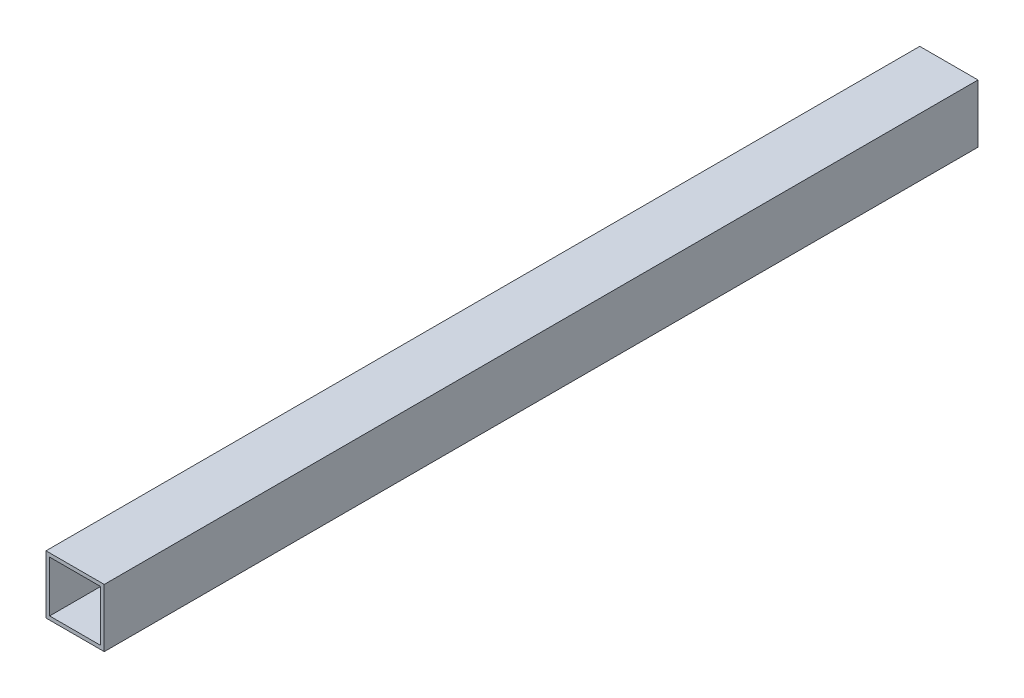
ISO-10303-21;
HEADER;
FILE_DESCRIPTION(('STEP AP214'),'2;1');
FILE_NAME('part.step','',(''),(''),'','','');
FILE_SCHEMA(('AUTOMOTIVE_DESIGN { 1 0 10303 214 1 1 1 1 }'));
ENDSEC;
DATA;
#1=APPLICATION_CONTEXT('core data for automotive mechanical design processes');
#2=APPLICATION_PROTOCOL_DEFINITION('international standard','automotive_design',2000,#1);
#3=PRODUCT_CONTEXT('',#1,'mechanical');
#4=PRODUCT('Part','Part','',(#3));
#5=PRODUCT_RELATED_PRODUCT_CATEGORY('part','',(#4));
#6=PRODUCT_DEFINITION_FORMATION('','',#4);
#7=PRODUCT_DEFINITION_CONTEXT('part definition',#1,'design');
#8=PRODUCT_DEFINITION('design','',#6,#7);
#9=PRODUCT_DEFINITION_SHAPE('','',#8);
#10=(LENGTH_UNIT() NAMED_UNIT(*) SI_UNIT(.MILLI.,.METRE.));
#11=(NAMED_UNIT(*) PLANE_ANGLE_UNIT() SI_UNIT($,.RADIAN.));
#12=(NAMED_UNIT(*) SI_UNIT($,.STERADIAN.) SOLID_ANGLE_UNIT());
#13=UNCERTAINTY_MEASURE_WITH_UNIT(LENGTH_MEASURE(1.E-05),#10,'distance_accuracy_value','');
#14=(GEOMETRIC_REPRESENTATION_CONTEXT(3) GLOBAL_UNCERTAINTY_ASSIGNED_CONTEXT((#13)) GLOBAL_UNIT_ASSIGNED_CONTEXT((#10,
#11,#12)) REPRESENTATION_CONTEXT('',''));
#15=CARTESIAN_POINT('',(0.,0.,0.));
#16=DIRECTION('',(0.,0.,1.));
#17=DIRECTION('',(1.,0.,0.));
#18=AXIS2_PLACEMENT_3D('',#15,#16,#17);
#19=CARTESIAN_POINT('',(12.7,25.4,190.5));
#20=DIRECTION('',(-1.,0.,0.));
#21=DIRECTION('',(0.,0.,1.));
#22=AXIS2_PLACEMENT_3D('',#19,#20,#21);
#23=PLANE('',#22);
#24=DIRECTION('',(0.,0.,-1.));
#25=VECTOR('',#24,1.);
#26=CARTESIAN_POINT('',(12.7,0.,190.5));
#27=LINE('',#26,#25);
#28=CARTESIAN_POINT('',(12.7,0.,190.5));
#29=VERTEX_POINT('',#28);
#30=CARTESIAN_POINT('',(12.7,0.,-190.5));
#31=VERTEX_POINT('',#30);
#32=EDGE_CURVE('E129',#29,#31,#27,.T.);
#33=ORIENTED_EDGE('',*,*,#32,.T.);
#34=DIRECTION('',(0.,-1.,0.));
#35=VECTOR('',#34,1.);
#36=CARTESIAN_POINT('',(12.7,25.4,-190.5));
#37=LINE('',#36,#35);
#38=CARTESIAN_POINT('',(12.7,25.4,-190.5));
#39=VERTEX_POINT('',#38);
#40=EDGE_CURVE('E11',#39,#31,#37,.T.);
#41=ORIENTED_EDGE('',*,*,#40,.F.);
#42=DIRECTION('',(0.,0.,-1.));
#43=VECTOR('',#42,1.);
#44=CARTESIAN_POINT('',(12.7,25.4,190.5));
#45=LINE('',#44,#43);
#46=CARTESIAN_POINT('',(12.7,25.4,190.5));
#47=VERTEX_POINT('',#46);
#48=EDGE_CURVE('E133',#47,#39,#45,.T.);
#49=ORIENTED_EDGE('',*,*,#48,.F.);
#50=DIRECTION('',(0.,-1.,0.));
#51=VECTOR('',#50,1.);
#52=CARTESIAN_POINT('',(12.7,25.4,190.5));
#53=LINE('',#52,#51);
#54=EDGE_CURVE('E143',#47,#29,#53,.T.);
#55=ORIENTED_EDGE('',*,*,#54,.T.);
#56=EDGE_LOOP('',(#33,#41,#49,#55));
#57=FACE_BOUND('',#56,.T.);
#58=ADVANCED_FACE('F32',(#57),#23,.F.);
#59=CARTESIAN_POINT('',(-12.7,25.4,-190.5));
#60=DIRECTION('',(0.,0.,1.));
#61=DIRECTION('',(1.,0.,0.));
#62=AXIS2_PLACEMENT_3D('',#59,#60,#61);
#63=PLANE('',#62);
#64=DIRECTION('',(1.,0.,0.));
#65=VECTOR('',#64,1.);
#66=CARTESIAN_POINT('',(-11.1125,1.5875,-190.5));
#67=LINE('',#66,#65);
#68=CARTESIAN_POINT('',(-11.1125,1.5875,-190.5));
#69=VERTEX_POINT('',#68);
#70=CARTESIAN_POINT('',(11.1125,1.5875,-190.5));
#71=VERTEX_POINT('',#70);
#72=EDGE_CURVE('E104',#69,#71,#67,.T.);
#73=ORIENTED_EDGE('',*,*,#72,.T.);
#74=DIRECTION('',(0.,1.,0.));
#75=VECTOR('',#74,1.);
#76=CARTESIAN_POINT('',(11.1125,1.5875,-190.5));
#77=LINE('',#76,#75);
#78=CARTESIAN_POINT('',(11.1125,23.8125,-190.5));
#79=VERTEX_POINT('',#78);
#80=EDGE_CURVE('E98',#71,#79,#77,.T.);
#81=ORIENTED_EDGE('',*,*,#80,.T.);
#82=DIRECTION('',(-1.,0.,0.));
#83=VECTOR('',#82,1.);
#84=CARTESIAN_POINT('',(-11.1125,23.8125,-190.5));
#85=LINE('',#84,#83);
#86=CARTESIAN_POINT('',(-11.1125,23.8125,-190.5));
#87=VERTEX_POINT('',#86);
#88=EDGE_CURVE('E107',#79,#87,#85,.T.);
#89=ORIENTED_EDGE('',*,*,#88,.T.);
#90=DIRECTION('',(0.,-1.,0.));
#91=VECTOR('',#90,1.);
#92=CARTESIAN_POINT('',(-11.1125,1.5875,-190.5));
#93=LINE('',#92,#91);
#94=EDGE_CURVE('E46',#87,#69,#93,.T.);
#95=ORIENTED_EDGE('',*,*,#94,.T.);
#96=EDGE_LOOP('',(#73,#81,#89,#95));
#97=FACE_BOUND('',#96,.T.);
#98=DIRECTION('',(-1.,0.,0.));
#99=VECTOR('',#98,1.);
#100=CARTESIAN_POINT('',(-12.7,0.,-190.5));
#101=LINE('',#100,#99);
#102=CARTESIAN_POINT('',(-12.7,0.,-190.5));
#103=VERTEX_POINT('',#102);
#104=EDGE_CURVE('E146',#31,#103,#101,.T.);
#105=ORIENTED_EDGE('',*,*,#104,.T.);
#106=DIRECTION('',(0.,-1.,0.));
#107=VECTOR('',#106,1.);
#108=CARTESIAN_POINT('',(-12.7,25.4,-190.5));
#109=LINE('',#108,#107);
#110=CARTESIAN_POINT('',(-12.7,25.4,-190.5));
#111=VERTEX_POINT('',#110);
#112=EDGE_CURVE('E39',#111,#103,#109,.T.);
#113=ORIENTED_EDGE('',*,*,#112,.F.);
#114=DIRECTION('',(-1.,0.,0.));
#115=VECTOR('',#114,1.);
#116=CARTESIAN_POINT('',(-12.7,25.4,-190.5));
#117=LINE('',#116,#115);
#118=EDGE_CURVE('E136',#39,#111,#117,.T.);
#119=ORIENTED_EDGE('',*,*,#118,.F.);
#120=ORIENTED_EDGE('',*,*,#40,.T.);
#121=EDGE_LOOP('',(#105,#113,#119,#120));
#122=FACE_BOUND('',#121,.T.);
#123=ADVANCED_FACE('F111',(#97,#122),#63,.F.);
#124=CARTESIAN_POINT('',(-12.7,25.4,190.5));
#125=DIRECTION('',(1.,0.,0.));
#126=DIRECTION('',(0.,0.,-1.));
#127=AXIS2_PLACEMENT_3D('',#124,#125,#126);
#128=PLANE('',#127);
#129=DIRECTION('',(0.,0.,1.));
#130=VECTOR('',#129,1.);
#131=CARTESIAN_POINT('',(-12.7,0.,190.5));
#132=LINE('',#131,#130);
#133=CARTESIAN_POINT('',(-12.7,0.,190.5));
#134=VERTEX_POINT('',#133);
#135=EDGE_CURVE('E148',#103,#134,#132,.T.);
#136=ORIENTED_EDGE('',*,*,#135,.T.);
#137=DIRECTION('',(0.,-1.,0.));
#138=VECTOR('',#137,1.);
#139=CARTESIAN_POINT('',(-12.7,25.4,190.5));
#140=LINE('',#139,#138);
#141=CARTESIAN_POINT('',(-12.7,25.4,190.5));
#142=VERTEX_POINT('',#141);
#143=EDGE_CURVE('E153',#142,#134,#140,.T.);
#144=ORIENTED_EDGE('',*,*,#143,.F.);
#145=DIRECTION('',(0.,0.,1.));
#146=VECTOR('',#145,1.);
#147=CARTESIAN_POINT('',(-12.7,25.4,190.5));
#148=LINE('',#147,#146);
#149=EDGE_CURVE('E139',#111,#142,#148,.T.);
#150=ORIENTED_EDGE('',*,*,#149,.F.);
#151=ORIENTED_EDGE('',*,*,#112,.T.);
#152=EDGE_LOOP('',(#136,#144,#150,#151));
#153=FACE_BOUND('',#152,.T.);
#154=ADVANCED_FACE('F160',(#153),#128,.F.);
#155=CARTESIAN_POINT('',(-12.7,25.4,190.5));
#156=DIRECTION('',(0.,0.,-1.));
#157=DIRECTION('',(-1.,0.,0.));
#158=AXIS2_PLACEMENT_3D('',#155,#156,#157);
#159=PLANE('',#158);
#160=DIRECTION('',(-1.,0.,0.));
#161=VECTOR('',#160,1.);
#162=CARTESIAN_POINT('',(-11.1125,23.8125,190.5));
#163=LINE('',#162,#161);
#164=CARTESIAN_POINT('',(11.1125,23.8125,190.5));
#165=VERTEX_POINT('',#164);
#166=CARTESIAN_POINT('',(-11.1125,23.8125,190.5));
#167=VERTEX_POINT('',#166);
#168=EDGE_CURVE('E123',#165,#167,#163,.T.);
#169=ORIENTED_EDGE('',*,*,#168,.F.);
#170=DIRECTION('',(0.,1.,0.));
#171=VECTOR('',#170,1.);
#172=CARTESIAN_POINT('',(11.1125,1.5875,190.5));
#173=LINE('',#172,#171);
#174=CARTESIAN_POINT('',(11.1125,1.5875,190.5));
#175=VERTEX_POINT('',#174);
#176=EDGE_CURVE('E54',#175,#165,#173,.T.);
#177=ORIENTED_EDGE('',*,*,#176,.F.);
#178=DIRECTION('',(1.,0.,0.));
#179=VECTOR('',#178,1.);
#180=CARTESIAN_POINT('',(-11.1125,1.5875,190.5));
#181=LINE('',#180,#179);
#182=CARTESIAN_POINT('',(-11.1125,1.5875,190.5));
#183=VERTEX_POINT('',#182);
#184=EDGE_CURVE('E114',#183,#175,#181,.T.);
#185=ORIENTED_EDGE('',*,*,#184,.F.);
#186=DIRECTION('',(0.,-1.,0.));
#187=VECTOR('',#186,1.);
#188=CARTESIAN_POINT('',(-11.1125,1.5875,190.5));
#189=LINE('',#188,#187);
#190=EDGE_CURVE('E117',#167,#183,#189,.T.);
#191=ORIENTED_EDGE('',*,*,#190,.F.);
#192=EDGE_LOOP('',(#169,#177,#185,#191));
#193=FACE_BOUND('',#192,.T.);
#194=DIRECTION('',(1.,0.,0.));
#195=VECTOR('',#194,1.);
#196=CARTESIAN_POINT('',(-12.7,0.,190.5));
#197=LINE('',#196,#195);
#198=EDGE_CURVE('E137',#134,#29,#197,.T.);
#199=ORIENTED_EDGE('',*,*,#198,.T.);
#200=ORIENTED_EDGE('',*,*,#54,.F.);
#201=DIRECTION('',(1.,0.,0.));
#202=VECTOR('',#201,1.);
#203=CARTESIAN_POINT('',(-12.7,25.4,190.5));
#204=LINE('',#203,#202);
#205=EDGE_CURVE('E141',#142,#47,#204,.T.);
#206=ORIENTED_EDGE('',*,*,#205,.F.);
#207=ORIENTED_EDGE('',*,*,#143,.T.);
#208=EDGE_LOOP('',(#199,#200,#206,#207));
#209=FACE_BOUND('',#208,.T.);
#210=ADVANCED_FACE('F168',(#193,#209),#159,.F.);
#211=CARTESIAN_POINT('',(0.,25.4,0.));
#212=DIRECTION('',(0.,-1.,0.));
#213=DIRECTION('',(0.,0.,-1.));
#214=AXIS2_PLACEMENT_3D('',#211,#212,#213);
#215=PLANE('',#214);
#216=ORIENTED_EDGE('',*,*,#48,.T.);
#217=ORIENTED_EDGE('',*,*,#118,.T.);
#218=ORIENTED_EDGE('',*,*,#149,.T.);
#219=ORIENTED_EDGE('',*,*,#205,.T.);
#220=EDGE_LOOP('',(#216,#217,#218,#219));
#221=FACE_BOUND('',#220,.T.);
#222=ADVANCED_FACE('F174',(#221),#215,.F.);
#223=CARTESIAN_POINT('',(0.,0.,0.));
#224=DIRECTION('',(0.,-1.,0.));
#225=DIRECTION('',(0.,0.,-1.));
#226=AXIS2_PLACEMENT_3D('',#223,#224,#225);
#227=PLANE('',#226);
#228=ORIENTED_EDGE('',*,*,#32,.F.);
#229=ORIENTED_EDGE('',*,*,#198,.F.);
#230=ORIENTED_EDGE('',*,*,#135,.F.);
#231=ORIENTED_EDGE('',*,*,#104,.F.);
#232=EDGE_LOOP('',(#228,#229,#230,#231));
#233=FACE_BOUND('',#232,.T.);
#234=ADVANCED_FACE('F165',(#233),#227,.T.);
#235=CARTESIAN_POINT('',(11.1125,1.5875,-190.5));
#236=DIRECTION('',(1.,0.,0.));
#237=DIRECTION('',(0.,0.,-1.));
#238=AXIS2_PLACEMENT_3D('',#235,#236,#237);
#239=PLANE('',#238);
#240=ORIENTED_EDGE('',*,*,#176,.T.);
#241=DIRECTION('',(0.,0.,1.));
#242=VECTOR('',#241,1.);
#243=CARTESIAN_POINT('',(11.1125,23.8125,-190.5));
#244=LINE('',#243,#242);
#245=EDGE_CURVE('E94',#79,#165,#244,.T.);
#246=ORIENTED_EDGE('',*,*,#245,.F.);
#247=ORIENTED_EDGE('',*,*,#80,.F.);
#248=DIRECTION('',(0.,0.,1.));
#249=VECTOR('',#248,1.);
#250=CARTESIAN_POINT('',(11.1125,1.5875,-190.5));
#251=LINE('',#250,#249);
#252=EDGE_CURVE('E127',#71,#175,#251,.T.);
#253=ORIENTED_EDGE('',*,*,#252,.T.);
#254=EDGE_LOOP('',(#240,#246,#247,#253));
#255=FACE_BOUND('',#254,.T.);
#256=ADVANCED_FACE('F96',(#255),#239,.F.);
#257=CARTESIAN_POINT('',(-11.1125,1.5875,-190.5));
#258=DIRECTION('',(0.,-1.,0.));
#259=DIRECTION('',(0.,0.,-1.));
#260=AXIS2_PLACEMENT_3D('',#257,#258,#259);
#261=PLANE('',#260);
#262=ORIENTED_EDGE('',*,*,#184,.T.);
#263=ORIENTED_EDGE('',*,*,#252,.F.);
#264=ORIENTED_EDGE('',*,*,#72,.F.);
#265=DIRECTION('',(0.,0.,1.));
#266=VECTOR('',#265,1.);
#267=CARTESIAN_POINT('',(-11.1125,1.5875,-190.5));
#268=LINE('',#267,#266);
#269=EDGE_CURVE('E130',#69,#183,#268,.T.);
#270=ORIENTED_EDGE('',*,*,#269,.T.);
#271=EDGE_LOOP('',(#262,#263,#264,#270));
#272=FACE_BOUND('',#271,.T.);
#273=ADVANCED_FACE('F191',(#272),#261,.F.);
#274=CARTESIAN_POINT('',(-11.1125,1.5875,-190.5));
#275=DIRECTION('',(-1.,0.,0.));
#276=DIRECTION('',(0.,0.,1.));
#277=AXIS2_PLACEMENT_3D('',#274,#275,#276);
#278=PLANE('',#277);
#279=ORIENTED_EDGE('',*,*,#190,.T.);
#280=ORIENTED_EDGE('',*,*,#269,.F.);
#281=ORIENTED_EDGE('',*,*,#94,.F.);
#282=DIRECTION('',(0.,0.,1.));
#283=VECTOR('',#282,1.);
#284=CARTESIAN_POINT('',(-11.1125,23.8125,-190.5));
#285=LINE('',#284,#283);
#286=EDGE_CURVE('E103',#87,#167,#285,.T.);
#287=ORIENTED_EDGE('',*,*,#286,.T.);
#288=EDGE_LOOP('',(#279,#280,#281,#287));
#289=FACE_BOUND('',#288,.T.);
#290=ADVANCED_FACE('F194',(#289),#278,.F.);
#291=CARTESIAN_POINT('',(-11.1125,23.8125,-190.5));
#292=DIRECTION('',(0.,1.,0.));
#293=DIRECTION('',(0.,0.,1.));
#294=AXIS2_PLACEMENT_3D('',#291,#292,#293);
#295=PLANE('',#294);
#296=ORIENTED_EDGE('',*,*,#168,.T.);
#297=ORIENTED_EDGE('',*,*,#286,.F.);
#298=ORIENTED_EDGE('',*,*,#88,.F.);
#299=ORIENTED_EDGE('',*,*,#245,.T.);
#300=EDGE_LOOP('',(#296,#297,#298,#299));
#301=FACE_BOUND('',#300,.T.);
#302=ADVANCED_FACE('F108',(#301),#295,.F.);
#303=CLOSED_SHELL('',(#58,#123,#154,#210,#222,#234,#256,#273,#290,#302));
#304=MANIFOLD_SOLID_BREP('B2',#303);
#305=ADVANCED_BREP_SHAPE_REPRESENTATION('',(#18,#304),#14);
#306=SHAPE_DEFINITION_REPRESENTATION(#9,#305);
ENDSEC;
END-ISO-10303-21;
